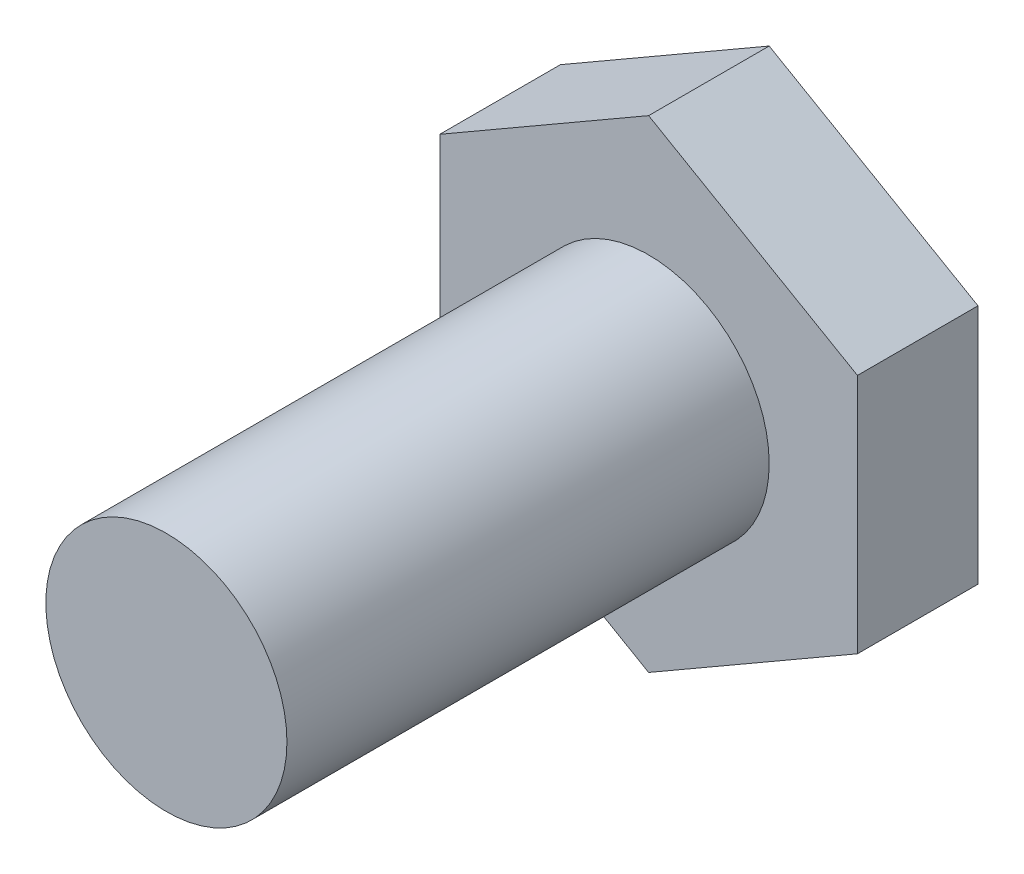
ISO-10303-21;
HEADER;
FILE_DESCRIPTION(('STEP AP214'),'2;1');
FILE_NAME('part.step','',(''),(''),'','','');
FILE_SCHEMA(('AUTOMOTIVE_DESIGN { 1 0 10303 214 1 1 1 1 }'));
ENDSEC;
DATA;
#1=APPLICATION_CONTEXT('core data for automotive mechanical design processes');
#2=APPLICATION_PROTOCOL_DEFINITION('international standard','automotive_design',2000,#1);
#3=PRODUCT_CONTEXT('',#1,'mechanical');
#4=PRODUCT('Part','Part','',(#3));
#5=PRODUCT_RELATED_PRODUCT_CATEGORY('part','',(#4));
#6=PRODUCT_DEFINITION_FORMATION('','',#4);
#7=PRODUCT_DEFINITION_CONTEXT('part definition',#1,'design');
#8=PRODUCT_DEFINITION('design','',#6,#7);
#9=PRODUCT_DEFINITION_SHAPE('','',#8);
#10=(LENGTH_UNIT() NAMED_UNIT(*) SI_UNIT(.MILLI.,.METRE.));
#11=(NAMED_UNIT(*) PLANE_ANGLE_UNIT() SI_UNIT($,.RADIAN.));
#12=(NAMED_UNIT(*) SI_UNIT($,.STERADIAN.) SOLID_ANGLE_UNIT());
#13=UNCERTAINTY_MEASURE_WITH_UNIT(LENGTH_MEASURE(1.E-05),#10,'distance_accuracy_value','');
#14=(GEOMETRIC_REPRESENTATION_CONTEXT(3) GLOBAL_UNCERTAINTY_ASSIGNED_CONTEXT((#13)) GLOBAL_UNIT_ASSIGNED_CONTEXT((#10,
#11,#12)) REPRESENTATION_CONTEXT('',''));
#15=CARTESIAN_POINT('',(0.,0.,0.));
#16=DIRECTION('',(0.,0.,1.));
#17=DIRECTION('',(1.,0.,0.));
#18=AXIS2_PLACEMENT_3D('',#15,#16,#17);
#19=CARTESIAN_POINT('',(0.,0.,8.));
#20=DIRECTION('',(0.,0.,-1.));
#21=DIRECTION('',(-1.,0.,0.));
#22=AXIS2_PLACEMENT_3D('',#19,#20,#21);
#23=CYLINDRICAL_SURFACE('',#22,2.);
#24=CARTESIAN_POINT('',(0.,0.,8.));
#25=DIRECTION('',(0.,0.,1.));
#26=DIRECTION('',(1.,0.,0.));
#27=AXIS2_PLACEMENT_3D('',#24,#25,#26);
#28=CIRCLE('',#27,2.);
#29=CARTESIAN_POINT('',(2.,0.,8.));
#30=VERTEX_POINT('',#29);
#31=EDGE_CURVE('E11',#30,#30,#28,.T.);
#32=ORIENTED_EDGE('',*,*,#31,.F.);
#33=EDGE_LOOP('',(#32));
#34=FACE_BOUND('',#33,.T.);
#35=CARTESIAN_POINT('',(0.,0.,0.));
#36=DIRECTION('',(0.,0.,1.));
#37=DIRECTION('',(1.,0.,0.));
#38=AXIS2_PLACEMENT_3D('',#35,#36,#37);
#39=CIRCLE('',#38,2.);
#40=CARTESIAN_POINT('',(2.,0.,0.));
#41=VERTEX_POINT('',#40);
#42=EDGE_CURVE('E47',#41,#41,#39,.T.);
#43=ORIENTED_EDGE('',*,*,#42,.T.);
#44=EDGE_LOOP('',(#43));
#45=FACE_BOUND('',#44,.T.);
#46=ADVANCED_FACE('F44',(#34,#45),#23,.T.);
#47=CARTESIAN_POINT('',(0.,0.,8.));
#48=DIRECTION('',(0.,0.,1.));
#49=DIRECTION('',(1.,0.,0.));
#50=AXIS2_PLACEMENT_3D('',#47,#48,#49);
#51=PLANE('',#50);
#52=ORIENTED_EDGE('',*,*,#31,.T.);
#53=EDGE_LOOP('',(#52));
#54=FACE_BOUND('',#53,.T.);
#55=ADVANCED_FACE('F188',(#54),#51,.T.);
#56=CARTESIAN_POINT('',(-1.73205080756887,3.00000000000002,-2.));
#57=DIRECTION('',(0.499999999999995,-0.866025403784441,0.));
#58=DIRECTION('',(0.866025403784442,0.499999999999995,0.));
#59=AXIS2_PLACEMENT_3D('',#56,#57,#58);
#60=PLANE('',#59);
#61=DIRECTION('',(0.866025403784441,0.499999999999995,0.));
#62=VECTOR('',#61,1.);
#63=CARTESIAN_POINT('',(-1.73205080756887,3.00000000000002,0.));
#64=LINE('',#63,#62);
#65=CARTESIAN_POINT('',(-3.46410161513773,2.00000000000004,0.));
#66=VERTEX_POINT('',#65);
#67=CARTESIAN_POINT('',(0.,4.,0.));
#68=VERTEX_POINT('',#67);
#69=EDGE_CURVE('E134',#66,#68,#64,.T.);
#70=ORIENTED_EDGE('',*,*,#69,.T.);
#71=DIRECTION('',(0.,0.,1.));
#72=VECTOR('',#71,1.);
#73=CARTESIAN_POINT('',(0.,4.,-2.));
#74=LINE('',#73,#72);
#75=CARTESIAN_POINT('',(0.,4.,-2.));
#76=VERTEX_POINT('',#75);
#77=EDGE_CURVE('E161',#76,#68,#74,.T.);
#78=ORIENTED_EDGE('',*,*,#77,.F.);
#79=DIRECTION('',(0.866025403784441,0.499999999999995,0.));
#80=VECTOR('',#79,1.);
#81=CARTESIAN_POINT('',(-1.73205080756887,3.00000000000002,-2.));
#82=LINE('',#81,#80);
#83=CARTESIAN_POINT('',(-3.46410161513773,2.00000000000004,-2.));
#84=VERTEX_POINT('',#83);
#85=EDGE_CURVE('E150',#84,#76,#82,.T.);
#86=ORIENTED_EDGE('',*,*,#85,.F.);
#87=DIRECTION('',(0.,0.,1.));
#88=VECTOR('',#87,1.);
#89=CARTESIAN_POINT('',(-3.46410161513773,2.00000000000004,-2.));
#90=LINE('',#89,#88);
#91=EDGE_CURVE('E130',#84,#66,#90,.T.);
#92=ORIENTED_EDGE('',*,*,#91,.T.);
#93=EDGE_LOOP('',(#70,#78,#86,#92));
#94=FACE_BOUND('',#93,.T.);
#95=ADVANCED_FACE('F176',(#94),#60,.F.);
#96=CARTESIAN_POINT('',(1.73205080756888,3.,-2.));
#97=DIRECTION('',(-0.500000000000001,-0.866025403784438,0.));
#98=DIRECTION('',(0.866025403784438,-0.500000000000001,0.));
#99=AXIS2_PLACEMENT_3D('',#96,#97,#98);
#100=PLANE('',#99);
#101=DIRECTION('',(0.866025403784438,-0.500000000000001,0.));
#102=VECTOR('',#101,1.);
#103=CARTESIAN_POINT('',(1.73205080756888,3.,0.));
#104=LINE('',#103,#102);
#105=CARTESIAN_POINT('',(3.46410161513776,1.99999999999999,0.));
#106=VERTEX_POINT('',#105);
#107=EDGE_CURVE('E138',#68,#106,#104,.T.);
#108=ORIENTED_EDGE('',*,*,#107,.T.);
#109=DIRECTION('',(0.,0.,1.));
#110=VECTOR('',#109,1.);
#111=CARTESIAN_POINT('',(3.46410161513776,1.99999999999999,-2.));
#112=LINE('',#111,#110);
#113=CARTESIAN_POINT('',(3.46410161513776,1.99999999999999,-2.));
#114=VERTEX_POINT('',#113);
#115=EDGE_CURVE('E157',#114,#106,#112,.T.);
#116=ORIENTED_EDGE('',*,*,#115,.F.);
#117=DIRECTION('',(0.866025403784438,-0.500000000000001,0.));
#118=VECTOR('',#117,1.);
#119=CARTESIAN_POINT('',(1.73205080756888,3.,-2.));
#120=LINE('',#119,#118);
#121=EDGE_CURVE('E99',#76,#114,#120,.T.);
#122=ORIENTED_EDGE('',*,*,#121,.F.);
#123=ORIENTED_EDGE('',*,*,#77,.T.);
#124=EDGE_LOOP('',(#108,#116,#122,#123));
#125=FACE_BOUND('',#124,.T.);
#126=ADVANCED_FACE('F198',(#125),#100,.F.);
#127=CARTESIAN_POINT('',(3.46410161513775,0.,-2.));
#128=DIRECTION('',(-1.,0.,0.));
#129=DIRECTION('',(0.,-1.,0.));
#130=AXIS2_PLACEMENT_3D('',#127,#128,#129);
#131=PLANE('',#130);
#132=DIRECTION('',(0.,-1.,0.));
#133=VECTOR('',#132,1.);
#134=CARTESIAN_POINT('',(3.46410161513775,0.,0.));
#135=LINE('',#134,#133);
#136=CARTESIAN_POINT('',(3.46410161513775,-2.00000000000002,0.));
#137=VERTEX_POINT('',#136);
#138=EDGE_CURVE('E141',#106,#137,#135,.T.);
#139=ORIENTED_EDGE('',*,*,#138,.T.);
#140=DIRECTION('',(0.,0.,1.));
#141=VECTOR('',#140,1.);
#142=CARTESIAN_POINT('',(3.46410161513775,-2.00000000000002,-2.));
#143=LINE('',#142,#141);
#144=CARTESIAN_POINT('',(3.46410161513775,-2.00000000000002,-2.));
#145=VERTEX_POINT('',#144);
#146=EDGE_CURVE('E123',#145,#137,#143,.T.);
#147=ORIENTED_EDGE('',*,*,#146,.F.);
#148=DIRECTION('',(0.,-1.,0.));
#149=VECTOR('',#148,1.);
#150=CARTESIAN_POINT('',(3.46410161513775,0.,-2.));
#151=LINE('',#150,#149);
#152=EDGE_CURVE('E112',#114,#145,#151,.T.);
#153=ORIENTED_EDGE('',*,*,#152,.F.);
#154=ORIENTED_EDGE('',*,*,#115,.T.);
#155=EDGE_LOOP('',(#139,#147,#153,#154));
#156=FACE_BOUND('',#155,.T.);
#157=ADVANCED_FACE('F203',(#156),#131,.F.);
#158=CARTESIAN_POINT('',(1.73205080756886,-3.00000000000001,-2.));
#159=DIRECTION('',(-0.499999999999995,0.866025403784442,0.));
#160=DIRECTION('',(-0.866025403784442,-0.499999999999995,0.));
#161=AXIS2_PLACEMENT_3D('',#158,#159,#160);
#162=PLANE('',#161);
#163=DIRECTION('',(-0.866025403784442,-0.499999999999995,0.));
#164=VECTOR('',#163,1.);
#165=CARTESIAN_POINT('',(1.73205080756886,-3.00000000000001,0.));
#166=LINE('',#165,#164);
#167=CARTESIAN_POINT('',(0.,-4.,0.));
#168=VERTEX_POINT('',#167);
#169=EDGE_CURVE('E121',#137,#168,#166,.T.);
#170=ORIENTED_EDGE('',*,*,#169,.T.);
#171=DIRECTION('',(0.,0.,1.));
#172=VECTOR('',#171,1.);
#173=CARTESIAN_POINT('',(0.,-4.,-2.));
#174=LINE('',#173,#172);
#175=CARTESIAN_POINT('',(0.,-4.,-2.));
#176=VERTEX_POINT('',#175);
#177=EDGE_CURVE('E118',#176,#168,#174,.T.);
#178=ORIENTED_EDGE('',*,*,#177,.F.);
#179=DIRECTION('',(-0.866025403784442,-0.499999999999995,0.));
#180=VECTOR('',#179,1.);
#181=CARTESIAN_POINT('',(1.73205080756886,-3.00000000000001,-2.));
#182=LINE('',#181,#180);
#183=EDGE_CURVE('E106',#145,#176,#182,.T.);
#184=ORIENTED_EDGE('',*,*,#183,.F.);
#185=ORIENTED_EDGE('',*,*,#146,.T.);
#186=EDGE_LOOP('',(#170,#178,#184,#185));
#187=FACE_BOUND('',#186,.T.);
#188=ADVANCED_FACE('F119',(#187),#162,.F.);
#189=CARTESIAN_POINT('',(-1.7320508075689,-2.99999999999998,-2.));
#190=DIRECTION('',(0.500000000000007,0.866025403784434,0.));
#191=DIRECTION('',(-0.866025403784435,0.500000000000007,0.));
#192=AXIS2_PLACEMENT_3D('',#189,#190,#191);
#193=PLANE('',#192);
#194=DIRECTION('',(-0.866025403784435,0.500000000000007,0.));
#195=VECTOR('',#194,1.);
#196=CARTESIAN_POINT('',(-1.7320508075689,-2.99999999999998,0.));
#197=LINE('',#196,#195);
#198=CARTESIAN_POINT('',(-3.46410161513777,-1.99999999999997,0.));
#199=VERTEX_POINT('',#198);
#200=EDGE_CURVE('E84',#168,#199,#197,.T.);
#201=ORIENTED_EDGE('',*,*,#200,.T.);
#202=DIRECTION('',(0.,0.,1.));
#203=VECTOR('',#202,1.);
#204=CARTESIAN_POINT('',(-3.46410161513777,-1.99999999999997,-2.));
#205=LINE('',#204,#203);
#206=CARTESIAN_POINT('',(-3.46410161513777,-1.99999999999997,-2.));
#207=VERTEX_POINT('',#206);
#208=EDGE_CURVE('E124',#207,#199,#205,.T.);
#209=ORIENTED_EDGE('',*,*,#208,.F.);
#210=DIRECTION('',(-0.866025403784435,0.500000000000007,0.));
#211=VECTOR('',#210,1.);
#212=CARTESIAN_POINT('',(-1.7320508075689,-2.99999999999998,-2.));
#213=LINE('',#212,#211);
#214=EDGE_CURVE('E110',#176,#207,#213,.T.);
#215=ORIENTED_EDGE('',*,*,#214,.F.);
#216=ORIENTED_EDGE('',*,*,#177,.T.);
#217=EDGE_LOOP('',(#201,#209,#215,#216));
#218=FACE_BOUND('',#217,.T.);
#219=ADVANCED_FACE('F126',(#218),#193,.F.);
#220=CARTESIAN_POINT('',(-3.46410161513775,0.,-2.));
#221=DIRECTION('',(1.,0.,0.));
#222=DIRECTION('',(0.,1.,0.));
#223=AXIS2_PLACEMENT_3D('',#220,#221,#222);
#224=PLANE('',#223);
#225=DIRECTION('',(0.,1.,0.));
#226=VECTOR('',#225,1.);
#227=CARTESIAN_POINT('',(-3.46410161513775,0.,0.));
#228=LINE('',#227,#226);
#229=EDGE_CURVE('E90',#199,#66,#228,.T.);
#230=ORIENTED_EDGE('',*,*,#229,.T.);
#231=ORIENTED_EDGE('',*,*,#91,.F.);
#232=DIRECTION('',(0.,1.,0.));
#233=VECTOR('',#232,1.);
#234=CARTESIAN_POINT('',(-3.46410161513775,0.,-2.));
#235=LINE('',#234,#233);
#236=EDGE_CURVE('E61',#207,#84,#235,.T.);
#237=ORIENTED_EDGE('',*,*,#236,.F.);
#238=ORIENTED_EDGE('',*,*,#208,.T.);
#239=EDGE_LOOP('',(#230,#231,#237,#238));
#240=FACE_BOUND('',#239,.T.);
#241=ADVANCED_FACE('F178',(#240),#224,.F.);
#242=CARTESIAN_POINT('',(0.,0.,-2.));
#243=DIRECTION('',(0.,0.,-1.));
#244=DIRECTION('',(-1.,0.,0.));
#245=AXIS2_PLACEMENT_3D('',#242,#243,#244);
#246=PLANE('',#245);
#247=ORIENTED_EDGE('',*,*,#85,.T.);
#248=ORIENTED_EDGE('',*,*,#121,.T.);
#249=ORIENTED_EDGE('',*,*,#152,.T.);
#250=ORIENTED_EDGE('',*,*,#183,.T.);
#251=ORIENTED_EDGE('',*,*,#214,.T.);
#252=ORIENTED_EDGE('',*,*,#236,.T.);
#253=EDGE_LOOP('',(#247,#248,#249,#250,#251,#252));
#254=FACE_BOUND('',#253,.T.);
#255=ADVANCED_FACE('F108',(#254),#246,.T.);
#256=CARTESIAN_POINT('',(0.,0.,0.));
#257=DIRECTION('',(0.,0.,-1.));
#258=DIRECTION('',(-1.,0.,0.));
#259=AXIS2_PLACEMENT_3D('',#256,#257,#258);
#260=PLANE('',#259);
#261=ORIENTED_EDGE('',*,*,#42,.F.);
#262=EDGE_LOOP('',(#261));
#263=FACE_BOUND('',#262,.T.);
#264=ORIENTED_EDGE('',*,*,#69,.F.);
#265=ORIENTED_EDGE('',*,*,#229,.F.);
#266=ORIENTED_EDGE('',*,*,#200,.F.);
#267=ORIENTED_EDGE('',*,*,#169,.F.);
#268=ORIENTED_EDGE('',*,*,#138,.F.);
#269=ORIENTED_EDGE('',*,*,#107,.F.);
#270=EDGE_LOOP('',(#264,#265,#266,#267,#268,#269));
#271=FACE_BOUND('',#270,.T.);
#272=ADVANCED_FACE('F169',(#263,#271),#260,.F.);
#273=CLOSED_SHELL('',(#46,#55,#95,#126,#157,#188,#219,#241,#255,#272));
#274=MANIFOLD_SOLID_BREP('B2',#273);
#275=ADVANCED_BREP_SHAPE_REPRESENTATION('',(#18,#274),#14);
#276=SHAPE_DEFINITION_REPRESENTATION(#9,#275);
ENDSEC;
END-ISO-10303-21;
